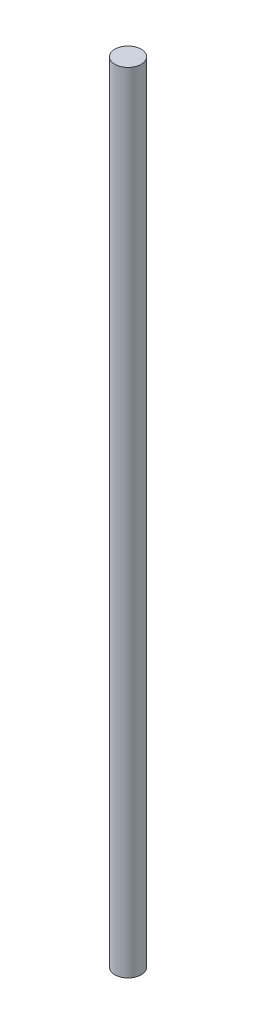
ISO-10303-21;
HEADER;
FILE_DESCRIPTION(('STEP AP214'),'2;1');
FILE_NAME('part.step','',(''),(''),'','','');
FILE_SCHEMA(('AUTOMOTIVE_DESIGN { 1 0 10303 214 1 1 1 1 }'));
ENDSEC;
DATA;
#1=APPLICATION_CONTEXT('core data for automotive mechanical design processes');
#2=APPLICATION_PROTOCOL_DEFINITION('international standard','automotive_design',2000,#1);
#3=PRODUCT_CONTEXT('',#1,'mechanical');
#4=PRODUCT('Part','Part','',(#3));
#5=PRODUCT_RELATED_PRODUCT_CATEGORY('part','',(#4));
#6=PRODUCT_DEFINITION_FORMATION('','',#4);
#7=PRODUCT_DEFINITION_CONTEXT('part definition',#1,'design');
#8=PRODUCT_DEFINITION('design','',#6,#7);
#9=PRODUCT_DEFINITION_SHAPE('','',#8);
#10=(LENGTH_UNIT() NAMED_UNIT(*) SI_UNIT(.MILLI.,.METRE.));
#11=(NAMED_UNIT(*) PLANE_ANGLE_UNIT() SI_UNIT($,.RADIAN.));
#12=(NAMED_UNIT(*) SI_UNIT($,.STERADIAN.) SOLID_ANGLE_UNIT());
#13=UNCERTAINTY_MEASURE_WITH_UNIT(LENGTH_MEASURE(1.E-05),#10,'distance_accuracy_value','');
#14=(GEOMETRIC_REPRESENTATION_CONTEXT(3) GLOBAL_UNCERTAINTY_ASSIGNED_CONTEXT((#13)) GLOBAL_UNIT_ASSIGNED_CONTEXT((#10,
#11,#12)) REPRESENTATION_CONTEXT('',''));
#15=CARTESIAN_POINT('',(0.,0.,0.));
#16=DIRECTION('',(0.,0.,1.));
#17=DIRECTION('',(1.,0.,0.));
#18=AXIS2_PLACEMENT_3D('',#15,#16,#17);
#19=CARTESIAN_POINT('',(0.,90.,0.));
#20=DIRECTION('',(0.,-1.,0.));
#21=DIRECTION('',(0.,0.,-1.));
#22=AXIS2_PLACEMENT_3D('',#19,#20,#21);
#23=CYLINDRICAL_SURFACE('',#22,1.5);
#24=CARTESIAN_POINT('',(0.,90.,0.));
#25=DIRECTION('',(0.,1.,0.));
#26=DIRECTION('',(0.,0.,1.));
#27=AXIS2_PLACEMENT_3D('',#24,#25,#26);
#28=CIRCLE('',#27,1.5);
#29=CARTESIAN_POINT('',(0.,90.,-1.5));
#30=VERTEX_POINT('',#29);
#31=EDGE_CURVE('E10',#30,#30,#28,.T.);
#32=CARTESIAN_POINT('',(0.,0.,0.));
#33=DIRECTION('',(0.,1.,0.));
#34=DIRECTION('',(0.,0.,1.));
#35=AXIS2_PLACEMENT_3D('',#32,#33,#34);
#36=CIRCLE('',#35,1.5);
#37=CARTESIAN_POINT('',(0.,0.,-1.5));
#38=VERTEX_POINT('',#37);
#39=EDGE_CURVE('E40',#38,#38,#36,.T.);
#40=CARTESIAN_POINT('',(0.,90.,-1.5));
#41=CARTESIAN_POINT('',(0.,89.0625,-1.5));
#42=CARTESIAN_POINT('',(0.,88.125,-1.5));
#43=CARTESIAN_POINT('',(0.,86.25,-1.5));
#44=CARTESIAN_POINT('',(0.,85.3125,-1.5));
#45=CARTESIAN_POINT('',(0.,83.4375,-1.5));
#46=CARTESIAN_POINT('',(0.,82.5,-1.5));
#47=CARTESIAN_POINT('',(0.,80.625,-1.5));
#48=CARTESIAN_POINT('',(0.,79.6875,-1.5));
#49=CARTESIAN_POINT('',(0.,77.8125,-1.5));
#50=CARTESIAN_POINT('',(0.,76.875,-1.5));
#51=CARTESIAN_POINT('',(0.,75.,-1.5));
#52=CARTESIAN_POINT('',(0.,74.0625,-1.5));
#53=CARTESIAN_POINT('',(0.,72.1875,-1.5));
#54=CARTESIAN_POINT('',(0.,71.25,-1.5));
#55=CARTESIAN_POINT('',(0.,69.375,-1.5));
#56=CARTESIAN_POINT('',(0.,68.4375,-1.5));
#57=CARTESIAN_POINT('',(0.,66.5625,-1.5));
#58=CARTESIAN_POINT('',(0.,65.625,-1.5));
#59=CARTESIAN_POINT('',(0.,63.75,-1.5));
#60=CARTESIAN_POINT('',(0.,62.8125,-1.5));
#61=CARTESIAN_POINT('',(0.,60.9375,-1.5));
#62=CARTESIAN_POINT('',(0.,60.,-1.5));
#63=CARTESIAN_POINT('',(0.,58.125,-1.5));
#64=CARTESIAN_POINT('',(0.,57.1875,-1.5));
#65=CARTESIAN_POINT('',(0.,55.3125,-1.5));
#66=CARTESIAN_POINT('',(0.,54.375,-1.5));
#67=CARTESIAN_POINT('',(0.,52.5,-1.5));
#68=CARTESIAN_POINT('',(0.,51.5625,-1.5));
#69=CARTESIAN_POINT('',(0.,49.6875,-1.5));
#70=CARTESIAN_POINT('',(0.,48.75,-1.5));
#71=CARTESIAN_POINT('',(0.,46.875,-1.5));
#72=CARTESIAN_POINT('',(0.,45.9375,-1.5));
#73=CARTESIAN_POINT('',(0.,44.0625,-1.5));
#74=CARTESIAN_POINT('',(0.,43.125,-1.5));
#75=CARTESIAN_POINT('',(0.,41.25,-1.5));
#76=CARTESIAN_POINT('',(0.,40.3125,-1.5));
#77=CARTESIAN_POINT('',(0.,38.4375,-1.5));
#78=CARTESIAN_POINT('',(0.,37.5,-1.5));
#79=CARTESIAN_POINT('',(0.,35.625,-1.5));
#80=CARTESIAN_POINT('',(0.,34.6875,-1.5));
#81=CARTESIAN_POINT('',(0.,32.8125,-1.5));
#82=CARTESIAN_POINT('',(0.,31.875,-1.5));
#83=CARTESIAN_POINT('',(0.,30.,-1.5));
#84=CARTESIAN_POINT('',(0.,29.0625,-1.5));
#85=CARTESIAN_POINT('',(0.,27.1875,-1.5));
#86=CARTESIAN_POINT('',(0.,26.25,-1.5));
#87=CARTESIAN_POINT('',(0.,24.375,-1.5));
#88=CARTESIAN_POINT('',(0.,23.4375,-1.5));
#89=CARTESIAN_POINT('',(0.,21.5625,-1.5));
#90=CARTESIAN_POINT('',(0.,20.625,-1.5));
#91=CARTESIAN_POINT('',(0.,18.75,-1.5));
#92=CARTESIAN_POINT('',(0.,17.8125,-1.5));
#93=CARTESIAN_POINT('',(0.,15.9375,-1.5));
#94=CARTESIAN_POINT('',(0.,15.,-1.5));
#95=CARTESIAN_POINT('',(0.,13.125,-1.5));
#96=CARTESIAN_POINT('',(0.,12.1875,-1.5));
#97=CARTESIAN_POINT('',(0.,10.3125,-1.5));
#98=CARTESIAN_POINT('',(0.,9.37499999999999,-1.5));
#99=CARTESIAN_POINT('',(0.,7.49999999999999,-1.5));
#100=CARTESIAN_POINT('',(0.,6.56249999999999,-1.5));
#101=CARTESIAN_POINT('',(0.,4.68749999999999,-1.5));
#102=CARTESIAN_POINT('',(0.,3.74999999999998,-1.5));
#103=CARTESIAN_POINT('',(0.,1.87499999999998,-1.5));
#104=CARTESIAN_POINT('',(0.,0.937499999999986,-1.5));
#105=CARTESIAN_POINT('',(0.,0.,-1.5));
#106=B_SPLINE_CURVE_WITH_KNOTS('',3,(#40,#41,#42,#43,#44,#45,#46,#47,#48,#49,#50,#51,#52,#53,
#54,#55,#56,#57,#58,#59,#60,#61,#62,#63,#64,#65,#66,#67,#68,#69,#70,#71,#72,#73,#74,#75,#76,#77,
#78,#79,#80,#81,#82,#83,#84,#85,#86,#87,#88,#89,#90,#91,#92,#93,#94,#95,#96,#97,#98,#99,#100,
#101,#102,#103,#104,#105),.UNSPECIFIED.,.F.,.F.,(4,2,2,2,2,2,2,2,2,2,2,2,2,2,2,2,2,2,2,2,2,2,2,
2,2,2,2,2,2,2,2,2,4),(0.,2.81250000000001,5.62500000000001,8.43750000000001,11.25,14.0625,
16.875,19.6875,22.5,25.3125,28.125,30.9375,33.75,36.5625,39.375,42.1875,45.,47.8125,50.625,
53.4375,56.25,59.0625,61.875,64.6875,67.5,70.3125,73.125,75.9375,78.75,81.5625,84.375,87.1875,
90.),.UNSPECIFIED.);
#107=EDGE_CURVE('BSEAM37',#30,#38,#106,.T.);
#108=ORIENTED_EDGE('',*,*,#31,.F.);
#109=ORIENTED_EDGE('',*,*,#39,.T.);
#110=ORIENTED_EDGE('',*,*,#107,.T.);
#111=ORIENTED_EDGE('',*,*,#107,.F.);
#112=EDGE_LOOP('',(#108,#110,#109,#111));
#113=FACE_BOUND('',#112,.T.);
#114=ADVANCED_FACE('F37',(#113),#23,.T.);
#115=CARTESIAN_POINT('',(0.,90.,0.));
#116=DIRECTION('',(0.,1.,0.));
#117=DIRECTION('',(0.,0.,1.));
#118=AXIS2_PLACEMENT_3D('',#115,#116,#117);
#119=PLANE('',#118);
#120=ORIENTED_EDGE('',*,*,#31,.T.);
#121=EDGE_LOOP('',(#120));
#122=FACE_BOUND('',#121,.T.);
#123=ADVANCED_FACE('F54',(#122),#119,.T.);
#124=CARTESIAN_POINT('',(0.,0.,0.));
#125=DIRECTION('',(0.,1.,0.));
#126=DIRECTION('',(0.,0.,1.));
#127=AXIS2_PLACEMENT_3D('',#124,#125,#126);
#128=PLANE('',#127);
#129=ORIENTED_EDGE('',*,*,#39,.F.);
#130=EDGE_LOOP('',(#129));
#131=FACE_BOUND('',#130,.T.);
#132=ADVANCED_FACE('F52',(#131),#128,.F.);
#133=CLOSED_SHELL('',(#114,#123,#132));
#134=MANIFOLD_SOLID_BREP('B2',#133);
#135=ADVANCED_BREP_SHAPE_REPRESENTATION('',(#18,#134),#14);
#136=SHAPE_DEFINITION_REPRESENTATION(#9,#135);
ENDSEC;
END-ISO-10303-21;
